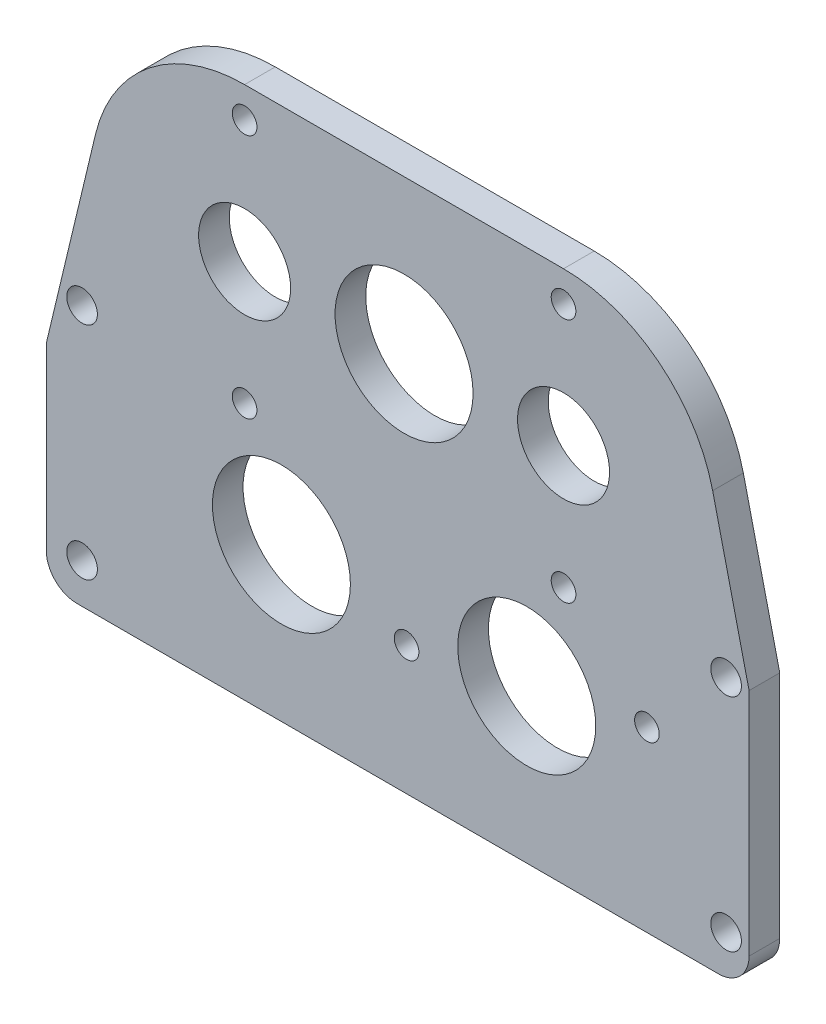
ISO-10303-21;
HEADER;
FILE_DESCRIPTION(('STEP AP214'),'2;1');
FILE_NAME('part.step','',(''),(''),'','','');
FILE_SCHEMA(('AUTOMOTIVE_DESIGN { 1 0 10303 214 1 1 1 1 }'));
ENDSEC;
DATA;
#1=APPLICATION_CONTEXT('core data for automotive mechanical design processes');
#2=APPLICATION_PROTOCOL_DEFINITION('international standard','automotive_design',2000,#1);
#3=PRODUCT_CONTEXT('',#1,'mechanical');
#4=PRODUCT('Part','Part','',(#3));
#5=PRODUCT_RELATED_PRODUCT_CATEGORY('part','',(#4));
#6=PRODUCT_DEFINITION_FORMATION('','',#4);
#7=PRODUCT_DEFINITION_CONTEXT('part definition',#1,'design');
#8=PRODUCT_DEFINITION('design','',#6,#7);
#9=PRODUCT_DEFINITION_SHAPE('','',#8);
#10=(LENGTH_UNIT() NAMED_UNIT(*) SI_UNIT(.MILLI.,.METRE.));
#11=(NAMED_UNIT(*) PLANE_ANGLE_UNIT() SI_UNIT($,.RADIAN.));
#12=(NAMED_UNIT(*) SI_UNIT($,.STERADIAN.) SOLID_ANGLE_UNIT());
#13=UNCERTAINTY_MEASURE_WITH_UNIT(LENGTH_MEASURE(1.E-05),#10,'distance_accuracy_value','');
#14=(GEOMETRIC_REPRESENTATION_CONTEXT(3) GLOBAL_UNCERTAINTY_ASSIGNED_CONTEXT((#13)) GLOBAL_UNIT_ASSIGNED_CONTEXT((#10,
#11,#12)) REPRESENTATION_CONTEXT('',''));
#15=CARTESIAN_POINT('',(0.,0.,0.));
#16=DIRECTION('',(0.,0.,1.));
#17=DIRECTION('',(1.,0.,0.));
#18=AXIS2_PLACEMENT_3D('',#15,#16,#17);
#19=CARTESIAN_POINT('',(58.42,46.9041106940532,6.35));
#20=DIRECTION('',(0.,0.,-1.));
#21=DIRECTION('',(-1.,0.,0.));
#22=AXIS2_PLACEMENT_3D('',#19,#20,#21);
#23=PLANE('',#22);
#24=DIRECTION('',(1.,0.,0.));
#25=VECTOR('',#24,1.);
#26=CARTESIAN_POINT('',(-48.6892529787857,-31.75,6.35));
#27=LINE('',#26,#25);
#28=CARTESIAN_POINT('',(-42.3392529787857,-31.75,6.35));
#29=VERTEX_POINT('',#28);
#30=CARTESIAN_POINT('',(90.4875,-31.75,6.35));
#31=VERTEX_POINT('',#30);
#32=EDGE_CURVE('E121',#29,#31,#27,.T.);
#33=ORIENTED_EDGE('',*,*,#32,.T.);
#34=CARTESIAN_POINT('',(90.4875,-25.4,6.35));
#35=DIRECTION('',(0.,0.,-1.));
#36=DIRECTION('',(-1.,0.,0.));
#37=AXIS2_PLACEMENT_3D('',#34,#35,#36);
#38=CIRCLE('',#37,6.35);
#39=CARTESIAN_POINT('',(96.8375,-25.4,6.35));
#40=VERTEX_POINT('',#39);
#41=EDGE_CURVE('E41',#31,#40,#38,.F.);
#42=ORIENTED_EDGE('',*,*,#41,.T.);
#43=DIRECTION('',(0.,1.,0.));
#44=VECTOR('',#43,1.);
#45=CARTESIAN_POINT('',(96.8375,22.225,6.35));
#46=LINE('',#45,#44);
#47=CARTESIAN_POINT('',(96.8375,22.225,6.35));
#48=VERTEX_POINT('',#47);
#49=EDGE_CURVE('E111',#40,#48,#46,.T.);
#50=ORIENTED_EDGE('',*,*,#49,.T.);
#51=DIRECTION('',(-0.228861878764831,0.973458905372092,0.));
#52=VECTOR('',#51,1.);
#53=CARTESIAN_POINT('',(96.8375,22.225,6.35));
#54=LINE('',#53,#52);
#55=CARTESIAN_POINT('',(89.2982328902418,54.2931047782294,6.35));
#56=VERTEX_POINT('',#55);
#57=EDGE_CURVE('E115',#48,#56,#54,.T.);
#58=ORIENTED_EDGE('',*,*,#57,.T.);
#59=CARTESIAN_POINT('',(58.42,46.9041106940532,6.35));
#60=DIRECTION('',(0.,0.,1.));
#61=DIRECTION('',(-1.,0.,0.));
#62=AXIS2_PLACEMENT_3D('',#59,#60,#61);
#63=CIRCLE('',#62,31.75);
#64=CARTESIAN_POINT('',(58.42,78.6541106940532,6.35));
#65=VERTEX_POINT('',#64);
#66=EDGE_CURVE('E136',#56,#65,#63,.T.);
#67=ORIENTED_EDGE('',*,*,#66,.T.);
#68=DIRECTION('',(-1.,0.,0.));
#69=VECTOR('',#68,1.);
#70=CARTESIAN_POINT('',(-7.62000000000001,78.6541106940532,6.35));
#71=LINE('',#70,#69);
#72=CARTESIAN_POINT('',(-7.62000000000001,78.6541106940532,6.35));
#73=VERTEX_POINT('',#72);
#74=EDGE_CURVE('E138',#65,#73,#71,.T.);
#75=ORIENTED_EDGE('',*,*,#74,.T.);
#76=CARTESIAN_POINT('',(-7.62000000000001,46.9041106940532,6.35));
#77=DIRECTION('',(0.,0.,1.));
#78=DIRECTION('',(-1.,0.,0.));
#79=AXIS2_PLACEMENT_3D('',#76,#77,#78);
#80=CIRCLE('',#79,31.75);
#81=CARTESIAN_POINT('',(-38.4982328902418,54.2931047782294,6.35));
#82=VERTEX_POINT('',#81);
#83=EDGE_CURVE('E143',#73,#82,#80,.T.);
#84=ORIENTED_EDGE('',*,*,#83,.T.);
#85=DIRECTION('',(-0.232724223123658,-0.972542768196592,0.));
#86=VECTOR('',#85,1.);
#87=CARTESIAN_POINT('',(-38.4982328902418,54.2931047782294,6.35));
#88=LINE('',#87,#86);
#89=CARTESIAN_POINT('',(-48.6892529787857,11.7053468103222,6.35));
#90=VERTEX_POINT('',#89);
#91=EDGE_CURVE('E145',#82,#90,#88,.T.);
#92=ORIENTED_EDGE('',*,*,#91,.T.);
#93=DIRECTION('',(0.,-1.,0.));
#94=VECTOR('',#93,1.);
#95=CARTESIAN_POINT('',(-48.6892529787857,11.7053468103222,6.35));
#96=LINE('',#95,#94);
#97=CARTESIAN_POINT('',(-48.6892529787857,-25.4,6.35));
#98=VERTEX_POINT('',#97);
#99=EDGE_CURVE('E164',#90,#98,#96,.T.);
#100=ORIENTED_EDGE('',*,*,#99,.T.);
#101=CARTESIAN_POINT('',(-42.3392529787857,-25.4,6.35));
#102=DIRECTION('',(0.,0.,-1.));
#103=DIRECTION('',(-1.,0.,0.));
#104=AXIS2_PLACEMENT_3D('',#101,#102,#103);
#105=CIRCLE('',#104,6.35);
#106=EDGE_CURVE('E186',#98,#29,#105,.F.);
#107=ORIENTED_EDGE('',*,*,#106,.T.);
#108=EDGE_LOOP('',(#33,#42,#50,#58,#67,#75,#84,#92,#100,#107));
#109=FACE_BOUND('',#108,.T.);
#110=CARTESIAN_POINT('',(0.,0.,6.35));
#111=DIRECTION('',(0.,0.,1.));
#112=DIRECTION('',(1.,0.,0.));
#113=AXIS2_PLACEMENT_3D('',#110,#111,#112);
#114=CIRCLE('',#113,14.2875);
#115=CARTESIAN_POINT('',(14.2875,0.,6.35));
#116=VERTEX_POINT('',#115);
#117=EDGE_CURVE('E151',#116,#116,#114,.T.);
#118=ORIENTED_EDGE('',*,*,#117,.F.);
#119=EDGE_LOOP('',(#118));
#120=FACE_BOUND('',#119,.T.);
#121=CARTESIAN_POINT('',(50.8,0.,6.35));
#122=DIRECTION('',(0.,0.,1.));
#123=DIRECTION('',(1.,0.,0.));
#124=AXIS2_PLACEMENT_3D('',#121,#122,#123);
#125=CIRCLE('',#124,14.2875);
#126=CARTESIAN_POINT('',(65.0875,0.,6.35));
#127=VERTEX_POINT('',#126);
#128=EDGE_CURVE('E545',#127,#127,#125,.T.);
#129=ORIENTED_EDGE('',*,*,#128,.F.);
#130=EDGE_LOOP('',(#129));
#131=FACE_BOUND('',#130,.T.);
#132=CARTESIAN_POINT('',(25.4,46.9041106940532,6.35));
#133=DIRECTION('',(0.,0.,1.));
#134=DIRECTION('',(1.,0.,0.));
#135=AXIS2_PLACEMENT_3D('',#132,#133,#134);
#136=CIRCLE('',#135,14.2875);
#137=CARTESIAN_POINT('',(39.6875,46.9041106940532,6.35));
#138=VERTEX_POINT('',#137);
#139=EDGE_CURVE('E539',#138,#138,#136,.T.);
#140=ORIENTED_EDGE('',*,*,#139,.F.);
#141=EDGE_LOOP('',(#140));
#142=FACE_BOUND('',#141,.T.);
#143=CARTESIAN_POINT('',(-7.62000000000001,72.3041106940532,6.35));
#144=DIRECTION('',(0.,0.,1.));
#145=DIRECTION('',(1.,0.,0.));
#146=AXIS2_PLACEMENT_3D('',#143,#144,#145);
#147=CIRCLE('',#146,2.5527);
#148=CARTESIAN_POINT('',(-5.06730000000002,72.3041106940532,6.35));
#149=VERTEX_POINT('',#148);
#150=EDGE_CURVE('E533',#149,#149,#147,.T.);
#151=ORIENTED_EDGE('',*,*,#150,.F.);
#152=EDGE_LOOP('',(#151));
#153=FACE_BOUND('',#152,.T.);
#154=CARTESIAN_POINT('',(-7.62000000000001,21.5041106940532,6.35));
#155=DIRECTION('',(0.,0.,1.));
#156=DIRECTION('',(1.,0.,0.));
#157=AXIS2_PLACEMENT_3D('',#154,#155,#156);
#158=CIRCLE('',#157,2.5527);
#159=CARTESIAN_POINT('',(-5.06730000000001,21.5041106940532,6.35));
#160=VERTEX_POINT('',#159);
#161=EDGE_CURVE('E527',#160,#160,#158,.T.);
#162=ORIENTED_EDGE('',*,*,#161,.F.);
#163=EDGE_LOOP('',(#162));
#164=FACE_BOUND('',#163,.T.);
#165=CARTESIAN_POINT('',(58.42,72.3041106940533,6.35));
#166=DIRECTION('',(0.,0.,1.));
#167=DIRECTION('',(1.,0.,0.));
#168=AXIS2_PLACEMENT_3D('',#165,#166,#167);
#169=CIRCLE('',#168,2.5527);
#170=CARTESIAN_POINT('',(60.9727,72.3041106940533,6.35));
#171=VERTEX_POINT('',#170);
#172=EDGE_CURVE('E521',#171,#171,#169,.T.);
#173=ORIENTED_EDGE('',*,*,#172,.F.);
#174=EDGE_LOOP('',(#173));
#175=FACE_BOUND('',#174,.T.);
#176=CARTESIAN_POINT('',(58.42,21.5041106940532,6.35));
#177=DIRECTION('',(0.,0.,1.));
#178=DIRECTION('',(1.,0.,0.));
#179=AXIS2_PLACEMENT_3D('',#176,#177,#178);
#180=CIRCLE('',#179,2.5527);
#181=CARTESIAN_POINT('',(60.9727,21.5041106940532,6.35));
#182=VERTEX_POINT('',#181);
#183=EDGE_CURVE('E515',#182,#182,#180,.T.);
#184=ORIENTED_EDGE('',*,*,#183,.F.);
#185=EDGE_LOOP('',(#184));
#186=FACE_BOUND('',#185,.T.);
#187=CARTESIAN_POINT('',(58.42,46.9041106940532,6.35));
#188=DIRECTION('',(0.,0.,1.));
#189=DIRECTION('',(1.,0.,0.));
#190=AXIS2_PLACEMENT_3D('',#187,#188,#189);
#191=CIRCLE('',#190,9.525);
#192=CARTESIAN_POINT('',(67.945,46.9041106940532,6.35));
#193=VERTEX_POINT('',#192);
#194=EDGE_CURVE('E509',#193,#193,#191,.T.);
#195=ORIENTED_EDGE('',*,*,#194,.F.);
#196=EDGE_LOOP('',(#195));
#197=FACE_BOUND('',#196,.T.);
#198=CARTESIAN_POINT('',(-7.62000000000001,46.9041106940532,6.35));
#199=DIRECTION('',(0.,0.,1.));
#200=DIRECTION('',(1.,0.,0.));
#201=AXIS2_PLACEMENT_3D('',#198,#199,#200);
#202=CIRCLE('',#201,9.525);
#203=CARTESIAN_POINT('',(1.90499999999999,46.9041106940532,6.35));
#204=VERTEX_POINT('',#203);
#205=EDGE_CURVE('E503',#204,#204,#202,.T.);
#206=ORIENTED_EDGE('',*,*,#205,.F.);
#207=EDGE_LOOP('',(#206));
#208=FACE_BOUND('',#207,.T.);
#209=CARTESIAN_POINT('',(25.9168201575522,-5.09778,6.35));
#210=DIRECTION('',(0.,0.,1.));
#211=DIRECTION('',(1.,0.,0.));
#212=AXIS2_PLACEMENT_3D('',#209,#210,#211);
#213=CIRCLE('',#212,2.5527);
#214=CARTESIAN_POINT('',(28.4695201575522,-5.09778,6.35));
#215=VERTEX_POINT('',#214);
#216=EDGE_CURVE('E497',#215,#215,#213,.T.);
#217=ORIENTED_EDGE('',*,*,#216,.F.);
#218=EDGE_LOOP('',(#217));
#219=FACE_BOUND('',#218,.T.);
#220=CARTESIAN_POINT('',(75.6831798424478,5.09777999999999,6.35));
#221=DIRECTION('',(0.,0.,1.));
#222=DIRECTION('',(1.,0.,0.));
#223=AXIS2_PLACEMENT_3D('',#220,#221,#222);
#224=CIRCLE('',#223,2.55270000000001);
#225=CARTESIAN_POINT('',(78.2358798424478,5.09777999999999,6.35));
#226=VERTEX_POINT('',#225);
#227=EDGE_CURVE('E491',#226,#226,#224,.T.);
#228=ORIENTED_EDGE('',*,*,#227,.F.);
#229=EDGE_LOOP('',(#228));
#230=FACE_BOUND('',#229,.T.);
#231=CARTESIAN_POINT('',(-41.275,22.225,6.35));
#232=DIRECTION('',(0.,0.,1.));
#233=DIRECTION('',(1.,0.,0.));
#234=AXIS2_PLACEMENT_3D('',#231,#232,#233);
#235=CIRCLE('',#234,3.17500000000098);
#236=CARTESIAN_POINT('',(-38.099999999999,22.225,6.35));
#237=VERTEX_POINT('',#236);
#238=EDGE_CURVE('E485',#237,#237,#235,.T.);
#239=ORIENTED_EDGE('',*,*,#238,.F.);
#240=EDGE_LOOP('',(#239));
#241=FACE_BOUND('',#240,.T.);
#242=CARTESIAN_POINT('',(92.075,22.225,6.35));
#243=DIRECTION('',(0.,0.,1.));
#244=DIRECTION('',(1.,0.,0.));
#245=AXIS2_PLACEMENT_3D('',#242,#243,#244);
#246=CIRCLE('',#245,3.17500000000098);
#247=CARTESIAN_POINT('',(95.250000000001,22.225,6.35));
#248=VERTEX_POINT('',#247);
#249=EDGE_CURVE('E479',#248,#248,#246,.T.);
#250=ORIENTED_EDGE('',*,*,#249,.F.);
#251=EDGE_LOOP('',(#250));
#252=FACE_BOUND('',#251,.T.);
#253=CARTESIAN_POINT('',(-41.275,-23.495,6.35));
#254=DIRECTION('',(0.,0.,1.));
#255=DIRECTION('',(1.,0.,0.));
#256=AXIS2_PLACEMENT_3D('',#253,#254,#255);
#257=CIRCLE('',#256,3.17500000000098);
#258=CARTESIAN_POINT('',(-38.099999999999,-23.495,6.35));
#259=VERTEX_POINT('',#258);
#260=EDGE_CURVE('E466',#259,#259,#257,.T.);
#261=ORIENTED_EDGE('',*,*,#260,.F.);
#262=EDGE_LOOP('',(#261));
#263=FACE_BOUND('',#262,.T.);
#264=CARTESIAN_POINT('',(92.075,-23.495,6.35));
#265=DIRECTION('',(0.,0.,1.));
#266=DIRECTION('',(1.,0.,0.));
#267=AXIS2_PLACEMENT_3D('',#264,#265,#266);
#268=CIRCLE('',#267,3.17500000000098);
#269=CARTESIAN_POINT('',(95.250000000001,-23.495,6.35));
#270=VERTEX_POINT('',#269);
#271=EDGE_CURVE('E470',#270,#270,#268,.T.);
#272=ORIENTED_EDGE('',*,*,#271,.F.);
#273=EDGE_LOOP('',(#272));
#274=FACE_BOUND('',#273,.T.);
#275=ADVANCED_FACE('F33',(#109,#120,#131,#142,#153,#164,#175,#186,#197,#208,#219,#230,#241,#252,
#263,#274),#23,.F.);
#276=CARTESIAN_POINT('',(58.42,46.9041106940532,0.));
#277=DIRECTION('',(0.,0.,-1.));
#278=DIRECTION('',(-1.,0.,0.));
#279=AXIS2_PLACEMENT_3D('',#276,#277,#278);
#280=PLANE('',#279);
#281=CARTESIAN_POINT('',(-41.275,-23.495,0.));
#282=DIRECTION('',(0.,0.,1.));
#283=DIRECTION('',(1.,0.,0.));
#284=AXIS2_PLACEMENT_3D('',#281,#282,#283);
#285=CIRCLE('',#284,3.17500000000098);
#286=CARTESIAN_POINT('',(-38.099999999999,-23.495,0.));
#287=VERTEX_POINT('',#286);
#288=EDGE_CURVE('E469',#287,#287,#285,.T.);
#289=ORIENTED_EDGE('',*,*,#288,.T.);
#290=EDGE_LOOP('',(#289));
#291=FACE_BOUND('',#290,.T.);
#292=CARTESIAN_POINT('',(-41.275,22.225,0.));
#293=DIRECTION('',(0.,0.,1.));
#294=DIRECTION('',(1.,0.,0.));
#295=AXIS2_PLACEMENT_3D('',#292,#293,#294);
#296=CIRCLE('',#295,3.17500000000098);
#297=CARTESIAN_POINT('',(-38.099999999999,22.225,0.));
#298=VERTEX_POINT('',#297);
#299=EDGE_CURVE('E482',#298,#298,#296,.T.);
#300=ORIENTED_EDGE('',*,*,#299,.T.);
#301=EDGE_LOOP('',(#300));
#302=FACE_BOUND('',#301,.T.);
#303=CARTESIAN_POINT('',(25.9168201575522,-5.09778,0.));
#304=DIRECTION('',(0.,0.,1.));
#305=DIRECTION('',(1.,0.,0.));
#306=AXIS2_PLACEMENT_3D('',#303,#304,#305);
#307=CIRCLE('',#306,2.5527);
#308=CARTESIAN_POINT('',(28.4695201575522,-5.09778,0.));
#309=VERTEX_POINT('',#308);
#310=EDGE_CURVE('E494',#309,#309,#307,.T.);
#311=ORIENTED_EDGE('',*,*,#310,.T.);
#312=EDGE_LOOP('',(#311));
#313=FACE_BOUND('',#312,.T.);
#314=CARTESIAN_POINT('',(58.42,46.9041106940532,0.));
#315=DIRECTION('',(0.,0.,1.));
#316=DIRECTION('',(1.,0.,0.));
#317=AXIS2_PLACEMENT_3D('',#314,#315,#316);
#318=CIRCLE('',#317,9.525);
#319=CARTESIAN_POINT('',(67.945,46.9041106940532,0.));
#320=VERTEX_POINT('',#319);
#321=EDGE_CURVE('E506',#320,#320,#318,.T.);
#322=ORIENTED_EDGE('',*,*,#321,.T.);
#323=EDGE_LOOP('',(#322));
#324=FACE_BOUND('',#323,.T.);
#325=CARTESIAN_POINT('',(58.42,72.3041106940533,0.));
#326=DIRECTION('',(0.,0.,1.));
#327=DIRECTION('',(1.,0.,0.));
#328=AXIS2_PLACEMENT_3D('',#325,#326,#327);
#329=CIRCLE('',#328,2.5527);
#330=CARTESIAN_POINT('',(60.9727,72.3041106940533,0.));
#331=VERTEX_POINT('',#330);
#332=EDGE_CURVE('E518',#331,#331,#329,.T.);
#333=ORIENTED_EDGE('',*,*,#332,.T.);
#334=EDGE_LOOP('',(#333));
#335=FACE_BOUND('',#334,.T.);
#336=CARTESIAN_POINT('',(-7.62000000000001,72.3041106940532,0.));
#337=DIRECTION('',(0.,0.,1.));
#338=DIRECTION('',(1.,0.,0.));
#339=AXIS2_PLACEMENT_3D('',#336,#337,#338);
#340=CIRCLE('',#339,2.5527);
#341=CARTESIAN_POINT('',(-5.06730000000002,72.3041106940532,0.));
#342=VERTEX_POINT('',#341);
#343=EDGE_CURVE('E530',#342,#342,#340,.T.);
#344=ORIENTED_EDGE('',*,*,#343,.T.);
#345=EDGE_LOOP('',(#344));
#346=FACE_BOUND('',#345,.T.);
#347=CARTESIAN_POINT('',(50.8,0.,0.));
#348=DIRECTION('',(0.,0.,1.));
#349=DIRECTION('',(1.,0.,0.));
#350=AXIS2_PLACEMENT_3D('',#347,#348,#349);
#351=CIRCLE('',#350,14.2875);
#352=CARTESIAN_POINT('',(65.0875,0.,0.));
#353=VERTEX_POINT('',#352);
#354=EDGE_CURVE('E542',#353,#353,#351,.T.);
#355=ORIENTED_EDGE('',*,*,#354,.T.);
#356=EDGE_LOOP('',(#355));
#357=FACE_BOUND('',#356,.T.);
#358=DIRECTION('',(0.,1.,0.));
#359=VECTOR('',#358,1.);
#360=CARTESIAN_POINT('',(96.8375,22.225,0.));
#361=LINE('',#360,#359);
#362=CARTESIAN_POINT('',(96.8375,-25.4,0.));
#363=VERTEX_POINT('',#362);
#364=CARTESIAN_POINT('',(96.8375,22.225,0.));
#365=VERTEX_POINT('',#364);
#366=EDGE_CURVE('E127',#363,#365,#361,.T.);
#367=ORIENTED_EDGE('',*,*,#366,.F.);
#368=CARTESIAN_POINT('',(90.4875,-25.4,0.));
#369=DIRECTION('',(0.,0.,-1.));
#370=DIRECTION('',(-1.,0.,0.));
#371=AXIS2_PLACEMENT_3D('',#368,#369,#370);
#372=CIRCLE('',#371,6.35);
#373=CARTESIAN_POINT('',(90.4875,-31.75,0.));
#374=VERTEX_POINT('',#373);
#375=EDGE_CURVE('E180',#363,#374,#372,.T.);
#376=ORIENTED_EDGE('',*,*,#375,.T.);
#377=DIRECTION('',(1.,0.,0.));
#378=VECTOR('',#377,1.);
#379=CARTESIAN_POINT('',(-48.6892529787857,-31.75,0.));
#380=LINE('',#379,#378);
#381=CARTESIAN_POINT('',(-42.3392529787857,-31.75,0.));
#382=VERTEX_POINT('',#381);
#383=EDGE_CURVE('E150',#382,#374,#380,.T.);
#384=ORIENTED_EDGE('',*,*,#383,.F.);
#385=CARTESIAN_POINT('',(-42.3392529787857,-25.4,0.));
#386=DIRECTION('',(0.,0.,-1.));
#387=DIRECTION('',(-1.,0.,0.));
#388=AXIS2_PLACEMENT_3D('',#385,#386,#387);
#389=CIRCLE('',#388,6.35);
#390=CARTESIAN_POINT('',(-48.6892529787857,-25.4,0.));
#391=VERTEX_POINT('',#390);
#392=EDGE_CURVE('E178',#382,#391,#389,.T.);
#393=ORIENTED_EDGE('',*,*,#392,.T.);
#394=DIRECTION('',(0.,-1.,0.));
#395=VECTOR('',#394,1.);
#396=CARTESIAN_POINT('',(-48.6892529787857,11.7053468103222,0.));
#397=LINE('',#396,#395);
#398=CARTESIAN_POINT('',(-48.6892529787857,11.7053468103222,0.));
#399=VERTEX_POINT('',#398);
#400=EDGE_CURVE('E148',#399,#391,#397,.T.);
#401=ORIENTED_EDGE('',*,*,#400,.F.);
#402=DIRECTION('',(-0.232724223123658,-0.972542768196592,0.));
#403=VECTOR('',#402,1.);
#404=CARTESIAN_POINT('',(-38.4982328902418,54.2931047782294,0.));
#405=LINE('',#404,#403);
#406=CARTESIAN_POINT('',(-38.4982328902418,54.2931047782294,0.));
#407=VERTEX_POINT('',#406);
#408=EDGE_CURVE('E162',#407,#399,#405,.T.);
#409=ORIENTED_EDGE('',*,*,#408,.F.);
#410=CARTESIAN_POINT('',(-7.62000000000001,46.9041106940532,0.));
#411=DIRECTION('',(0.,0.,1.));
#412=DIRECTION('',(-1.,0.,0.));
#413=AXIS2_PLACEMENT_3D('',#410,#411,#412);
#414=CIRCLE('',#413,31.75);
#415=CARTESIAN_POINT('',(-7.62000000000001,78.6541106940532,0.));
#416=VERTEX_POINT('',#415);
#417=EDGE_CURVE('E160',#416,#407,#414,.T.);
#418=ORIENTED_EDGE('',*,*,#417,.F.);
#419=DIRECTION('',(-1.,0.,0.));
#420=VECTOR('',#419,1.);
#421=CARTESIAN_POINT('',(-7.62000000000001,78.6541106940532,0.));
#422=LINE('',#421,#420);
#423=CARTESIAN_POINT('',(58.42,78.6541106940532,0.));
#424=VERTEX_POINT('',#423);
#425=EDGE_CURVE('E158',#424,#416,#422,.T.);
#426=ORIENTED_EDGE('',*,*,#425,.F.);
#427=CARTESIAN_POINT('',(58.42,46.9041106940532,0.));
#428=DIRECTION('',(0.,0.,1.));
#429=DIRECTION('',(-1.,0.,0.));
#430=AXIS2_PLACEMENT_3D('',#427,#428,#429);
#431=CIRCLE('',#430,31.75);
#432=CARTESIAN_POINT('',(89.2982328902418,54.2931047782294,0.));
#433=VERTEX_POINT('',#432);
#434=EDGE_CURVE('E156',#433,#424,#431,.T.);
#435=ORIENTED_EDGE('',*,*,#434,.F.);
#436=DIRECTION('',(-0.228861878764831,0.973458905372092,0.));
#437=VECTOR('',#436,1.);
#438=CARTESIAN_POINT('',(96.8375,22.225,0.));
#439=LINE('',#438,#437);
#440=EDGE_CURVE('E154',#365,#433,#439,.T.);
#441=ORIENTED_EDGE('',*,*,#440,.F.);
#442=EDGE_LOOP('',(#367,#376,#384,#393,#401,#409,#418,#426,#435,#441));
#443=FACE_BOUND('',#442,.T.);
#444=CARTESIAN_POINT('',(0.,0.,0.));
#445=DIRECTION('',(0.,0.,1.));
#446=DIRECTION('',(1.,0.,0.));
#447=AXIS2_PLACEMENT_3D('',#444,#445,#446);
#448=CIRCLE('',#447,14.2875);
#449=CARTESIAN_POINT('',(14.2875,0.,0.));
#450=VERTEX_POINT('',#449);
#451=EDGE_CURVE('E548',#450,#450,#448,.T.);
#452=ORIENTED_EDGE('',*,*,#451,.T.);
#453=EDGE_LOOP('',(#452));
#454=FACE_BOUND('',#453,.T.);
#455=CARTESIAN_POINT('',(25.4,46.9041106940532,0.));
#456=DIRECTION('',(0.,0.,1.));
#457=DIRECTION('',(1.,0.,0.));
#458=AXIS2_PLACEMENT_3D('',#455,#456,#457);
#459=CIRCLE('',#458,14.2875);
#460=CARTESIAN_POINT('',(39.6875,46.9041106940532,0.));
#461=VERTEX_POINT('',#460);
#462=EDGE_CURVE('E536',#461,#461,#459,.T.);
#463=ORIENTED_EDGE('',*,*,#462,.T.);
#464=EDGE_LOOP('',(#463));
#465=FACE_BOUND('',#464,.T.);
#466=CARTESIAN_POINT('',(-7.62000000000001,21.5041106940532,0.));
#467=DIRECTION('',(0.,0.,1.));
#468=DIRECTION('',(1.,0.,0.));
#469=AXIS2_PLACEMENT_3D('',#466,#467,#468);
#470=CIRCLE('',#469,2.5527);
#471=CARTESIAN_POINT('',(-5.06730000000001,21.5041106940532,0.));
#472=VERTEX_POINT('',#471);
#473=EDGE_CURVE('E524',#472,#472,#470,.T.);
#474=ORIENTED_EDGE('',*,*,#473,.T.);
#475=EDGE_LOOP('',(#474));
#476=FACE_BOUND('',#475,.T.);
#477=CARTESIAN_POINT('',(58.42,21.5041106940532,0.));
#478=DIRECTION('',(0.,0.,1.));
#479=DIRECTION('',(1.,0.,0.));
#480=AXIS2_PLACEMENT_3D('',#477,#478,#479);
#481=CIRCLE('',#480,2.5527);
#482=CARTESIAN_POINT('',(60.9727,21.5041106940532,0.));
#483=VERTEX_POINT('',#482);
#484=EDGE_CURVE('E512',#483,#483,#481,.T.);
#485=ORIENTED_EDGE('',*,*,#484,.T.);
#486=EDGE_LOOP('',(#485));
#487=FACE_BOUND('',#486,.T.);
#488=CARTESIAN_POINT('',(-7.62000000000001,46.9041106940532,0.));
#489=DIRECTION('',(0.,0.,1.));
#490=DIRECTION('',(1.,0.,0.));
#491=AXIS2_PLACEMENT_3D('',#488,#489,#490);
#492=CIRCLE('',#491,9.525);
#493=CARTESIAN_POINT('',(1.90499999999999,46.9041106940532,0.));
#494=VERTEX_POINT('',#493);
#495=EDGE_CURVE('E500',#494,#494,#492,.T.);
#496=ORIENTED_EDGE('',*,*,#495,.T.);
#497=EDGE_LOOP('',(#496));
#498=FACE_BOUND('',#497,.T.);
#499=CARTESIAN_POINT('',(75.6831798424478,5.09777999999999,0.));
#500=DIRECTION('',(0.,0.,1.));
#501=DIRECTION('',(1.,0.,0.));
#502=AXIS2_PLACEMENT_3D('',#499,#500,#501);
#503=CIRCLE('',#502,2.55270000000001);
#504=CARTESIAN_POINT('',(78.2358798424478,5.09777999999999,0.));
#505=VERTEX_POINT('',#504);
#506=EDGE_CURVE('E488',#505,#505,#503,.T.);
#507=ORIENTED_EDGE('',*,*,#506,.T.);
#508=EDGE_LOOP('',(#507));
#509=FACE_BOUND('',#508,.T.);
#510=CARTESIAN_POINT('',(92.075,22.225,0.));
#511=DIRECTION('',(0.,0.,1.));
#512=DIRECTION('',(1.,0.,0.));
#513=AXIS2_PLACEMENT_3D('',#510,#511,#512);
#514=CIRCLE('',#513,3.17500000000098);
#515=CARTESIAN_POINT('',(95.250000000001,22.225,0.));
#516=VERTEX_POINT('',#515);
#517=EDGE_CURVE('E472',#516,#516,#514,.T.);
#518=ORIENTED_EDGE('',*,*,#517,.T.);
#519=EDGE_LOOP('',(#518));
#520=FACE_BOUND('',#519,.T.);
#521=CARTESIAN_POINT('',(92.075,-23.495,0.));
#522=DIRECTION('',(0.,0.,1.));
#523=DIRECTION('',(1.,0.,0.));
#524=AXIS2_PLACEMENT_3D('',#521,#522,#523);
#525=CIRCLE('',#524,3.17500000000098);
#526=CARTESIAN_POINT('',(95.250000000001,-23.495,0.));
#527=VERTEX_POINT('',#526);
#528=EDGE_CURVE('E475',#527,#527,#525,.T.);
#529=ORIENTED_EDGE('',*,*,#528,.T.);
#530=EDGE_LOOP('',(#529));
#531=FACE_BOUND('',#530,.T.);
#532=ADVANCED_FACE('F194',(#291,#302,#313,#324,#335,#346,#357,#443,#454,#465,#476,#487,#498,
#509,#520,#531),#280,.T.);
#533=CARTESIAN_POINT('',(-48.6892529787857,11.7053468103222,6.35));
#534=DIRECTION('',(1.,0.,0.));
#535=DIRECTION('',(0.,1.,0.));
#536=AXIS2_PLACEMENT_3D('',#533,#534,#535);
#537=PLANE('',#536);
#538=ORIENTED_EDGE('',*,*,#400,.T.);
#539=DIRECTION('',(0.,0.,-1.));
#540=VECTOR('',#539,1.);
#541=CARTESIAN_POINT('',(-48.6892529787857,-25.4,6.35));
#542=LINE('',#541,#540);
#543=EDGE_CURVE('E11',#391,#98,#542,.F.);
#544=ORIENTED_EDGE('',*,*,#543,.T.);
#545=ORIENTED_EDGE('',*,*,#99,.F.);
#546=DIRECTION('',(0.,0.,-1.));
#547=VECTOR('',#546,1.);
#548=CARTESIAN_POINT('',(-48.6892529787857,11.7053468103222,6.35));
#549=LINE('',#548,#547);
#550=EDGE_CURVE('E147',#90,#399,#549,.T.);
#551=ORIENTED_EDGE('',*,*,#550,.T.);
#552=EDGE_LOOP('',(#538,#544,#545,#551));
#553=FACE_BOUND('',#552,.T.);
#554=ADVANCED_FACE('F197',(#553),#537,.F.);
#555=CARTESIAN_POINT('',(-48.6892529787857,-31.75,6.35));
#556=DIRECTION('',(0.,1.,0.));
#557=DIRECTION('',(0.,0.,1.));
#558=AXIS2_PLACEMENT_3D('',#555,#556,#557);
#559=PLANE('',#558);
#560=ORIENTED_EDGE('',*,*,#383,.T.);
#561=DIRECTION('',(0.,0.,-1.));
#562=VECTOR('',#561,1.);
#563=CARTESIAN_POINT('',(90.4875,-31.75,6.35));
#564=LINE('',#563,#562);
#565=EDGE_CURVE('E54',#374,#31,#564,.F.);
#566=ORIENTED_EDGE('',*,*,#565,.T.);
#567=ORIENTED_EDGE('',*,*,#32,.F.);
#568=DIRECTION('',(0.,0.,-1.));
#569=VECTOR('',#568,1.);
#570=CARTESIAN_POINT('',(-42.3392529787857,-31.75,6.35));
#571=LINE('',#570,#569);
#572=EDGE_CURVE('E182',#29,#382,#571,.T.);
#573=ORIENTED_EDGE('',*,*,#572,.T.);
#574=EDGE_LOOP('',(#560,#566,#567,#573));
#575=FACE_BOUND('',#574,.T.);
#576=ADVANCED_FACE('F190',(#575),#559,.F.);
#577=CARTESIAN_POINT('',(96.8375,22.225,6.35));
#578=DIRECTION('',(-1.,0.,0.));
#579=DIRECTION('',(0.,0.,1.));
#580=AXIS2_PLACEMENT_3D('',#577,#578,#579);
#581=PLANE('',#580);
#582=ORIENTED_EDGE('',*,*,#49,.F.);
#583=DIRECTION('',(0.,0.,-1.));
#584=VECTOR('',#583,1.);
#585=CARTESIAN_POINT('',(96.8375,-25.4,6.35));
#586=LINE('',#585,#584);
#587=EDGE_CURVE('E130',#40,#363,#586,.T.);
#588=ORIENTED_EDGE('',*,*,#587,.T.);
#589=ORIENTED_EDGE('',*,*,#366,.T.);
#590=DIRECTION('',(0.,0.,-1.));
#591=VECTOR('',#590,1.);
#592=CARTESIAN_POINT('',(96.8375,22.225,6.35));
#593=LINE('',#592,#591);
#594=EDGE_CURVE('E124',#48,#365,#593,.T.);
#595=ORIENTED_EDGE('',*,*,#594,.F.);
#596=EDGE_LOOP('',(#582,#588,#589,#595));
#597=FACE_BOUND('',#596,.T.);
#598=ADVANCED_FACE('F125',(#597),#581,.F.);
#599=CARTESIAN_POINT('',(96.8375,22.225,6.35));
#600=DIRECTION('',(-0.973458905372092,-0.228861878764831,0.));
#601=DIRECTION('',(0.228861878764831,-0.973458905372092,0.));
#602=AXIS2_PLACEMENT_3D('',#599,#600,#601);
#603=PLANE('',#602);
#604=ORIENTED_EDGE('',*,*,#440,.T.);
#605=DIRECTION('',(0.,0.,-1.));
#606=VECTOR('',#605,1.);
#607=CARTESIAN_POINT('',(89.2982328902418,54.2931047782294,6.35));
#608=LINE('',#607,#606);
#609=EDGE_CURVE('E131',#56,#433,#608,.T.);
#610=ORIENTED_EDGE('',*,*,#609,.F.);
#611=ORIENTED_EDGE('',*,*,#57,.F.);
#612=ORIENTED_EDGE('',*,*,#594,.T.);
#613=EDGE_LOOP('',(#604,#610,#611,#612));
#614=FACE_BOUND('',#613,.T.);
#615=ADVANCED_FACE('F133',(#614),#603,.F.);
#616=CARTESIAN_POINT('',(58.42,46.9041106940532,6.35));
#617=DIRECTION('',(0.,0.,-1.));
#618=DIRECTION('',(-1.,0.,0.));
#619=AXIS2_PLACEMENT_3D('',#616,#617,#618);
#620=CYLINDRICAL_SURFACE('',#619,31.75);
#621=ORIENTED_EDGE('',*,*,#434,.T.);
#622=DIRECTION('',(0.,0.,-1.));
#623=VECTOR('',#622,1.);
#624=CARTESIAN_POINT('',(58.42,78.6541106940532,6.35));
#625=LINE('',#624,#623);
#626=EDGE_CURVE('E173',#65,#424,#625,.T.);
#627=ORIENTED_EDGE('',*,*,#626,.F.);
#628=ORIENTED_EDGE('',*,*,#66,.F.);
#629=ORIENTED_EDGE('',*,*,#609,.T.);
#630=EDGE_LOOP('',(#621,#627,#628,#629));
#631=FACE_BOUND('',#630,.T.);
#632=ADVANCED_FACE('F215',(#631),#620,.T.);
#633=CARTESIAN_POINT('',(-7.62000000000001,78.6541106940532,6.35));
#634=DIRECTION('',(0.,-1.,0.));
#635=DIRECTION('',(1.,0.,0.));
#636=AXIS2_PLACEMENT_3D('',#633,#634,#635);
#637=PLANE('',#636);
#638=ORIENTED_EDGE('',*,*,#425,.T.);
#639=DIRECTION('',(0.,0.,-1.));
#640=VECTOR('',#639,1.);
#641=CARTESIAN_POINT('',(-7.62000000000001,78.6541106940532,6.35));
#642=LINE('',#641,#640);
#643=EDGE_CURVE('E170',#73,#416,#642,.T.);
#644=ORIENTED_EDGE('',*,*,#643,.F.);
#645=ORIENTED_EDGE('',*,*,#74,.F.);
#646=ORIENTED_EDGE('',*,*,#626,.T.);
#647=EDGE_LOOP('',(#638,#644,#645,#646));
#648=FACE_BOUND('',#647,.T.);
#649=ADVANCED_FACE('F212',(#648),#637,.F.);
#650=CARTESIAN_POINT('',(-7.62000000000001,46.9041106940532,6.35));
#651=DIRECTION('',(0.,0.,-1.));
#652=DIRECTION('',(-1.,0.,0.));
#653=AXIS2_PLACEMENT_3D('',#650,#651,#652);
#654=CYLINDRICAL_SURFACE('',#653,31.75);
#655=ORIENTED_EDGE('',*,*,#417,.T.);
#656=DIRECTION('',(0.,0.,-1.));
#657=VECTOR('',#656,1.);
#658=CARTESIAN_POINT('',(-38.4982328902418,54.2931047782294,6.35));
#659=LINE('',#658,#657);
#660=EDGE_CURVE('E167',#82,#407,#659,.T.);
#661=ORIENTED_EDGE('',*,*,#660,.F.);
#662=ORIENTED_EDGE('',*,*,#83,.F.);
#663=ORIENTED_EDGE('',*,*,#643,.T.);
#664=EDGE_LOOP('',(#655,#661,#662,#663));
#665=FACE_BOUND('',#664,.T.);
#666=ADVANCED_FACE('F207',(#665),#654,.T.);
#667=CARTESIAN_POINT('',(-38.4982328902418,54.2931047782294,6.35));
#668=DIRECTION('',(0.972542768196592,-0.232724223123658,0.));
#669=DIRECTION('',(0.232724223123658,0.972542768196592,0.));
#670=AXIS2_PLACEMENT_3D('',#667,#668,#669);
#671=PLANE('',#670);
#672=ORIENTED_EDGE('',*,*,#408,.T.);
#673=ORIENTED_EDGE('',*,*,#550,.F.);
#674=ORIENTED_EDGE('',*,*,#91,.F.);
#675=ORIENTED_EDGE('',*,*,#660,.T.);
#676=EDGE_LOOP('',(#672,#673,#674,#675));
#677=FACE_BOUND('',#676,.T.);
#678=ADVANCED_FACE('F201',(#677),#671,.F.);
#679=CARTESIAN_POINT('',(0.,0.,6.35));
#680=DIRECTION('',(0.,0.,-1.));
#681=DIRECTION('',(-1.,0.,0.));
#682=AXIS2_PLACEMENT_3D('',#679,#680,#681);
#683=CYLINDRICAL_SURFACE('',#682,14.2875);
#684=ORIENTED_EDGE('',*,*,#117,.T.);
#685=EDGE_LOOP('',(#684));
#686=FACE_BOUND('',#685,.T.);
#687=ORIENTED_EDGE('',*,*,#451,.F.);
#688=EDGE_LOOP('',(#687));
#689=FACE_BOUND('',#688,.T.);
#690=ADVANCED_FACE('F236',(#686,#689),#683,.F.);
#691=CARTESIAN_POINT('',(50.8,0.,6.35));
#692=DIRECTION('',(0.,0.,-1.));
#693=DIRECTION('',(-1.,0.,0.));
#694=AXIS2_PLACEMENT_3D('',#691,#692,#693);
#695=CYLINDRICAL_SURFACE('',#694,14.2875);
#696=ORIENTED_EDGE('',*,*,#128,.T.);
#697=EDGE_LOOP('',(#696));
#698=FACE_BOUND('',#697,.T.);
#699=ORIENTED_EDGE('',*,*,#354,.F.);
#700=EDGE_LOOP('',(#699));
#701=FACE_BOUND('',#700,.T.);
#702=ADVANCED_FACE('F291',(#698,#701),#695,.F.);
#703=CARTESIAN_POINT('',(25.4,46.9041106940532,6.35));
#704=DIRECTION('',(0.,0.,-1.));
#705=DIRECTION('',(-1.,0.,0.));
#706=AXIS2_PLACEMENT_3D('',#703,#704,#705);
#707=CYLINDRICAL_SURFACE('',#706,14.2875);
#708=ORIENTED_EDGE('',*,*,#139,.T.);
#709=EDGE_LOOP('',(#708));
#710=FACE_BOUND('',#709,.T.);
#711=ORIENTED_EDGE('',*,*,#462,.F.);
#712=EDGE_LOOP('',(#711));
#713=FACE_BOUND('',#712,.T.);
#714=ADVANCED_FACE('F298',(#710,#713),#707,.F.);
#715=CARTESIAN_POINT('',(-7.62000000000001,72.3041106940532,6.35));
#716=DIRECTION('',(0.,0.,-1.));
#717=DIRECTION('',(-1.,0.,0.));
#718=AXIS2_PLACEMENT_3D('',#715,#716,#717);
#719=CYLINDRICAL_SURFACE('',#718,2.5527);
#720=ORIENTED_EDGE('',*,*,#150,.T.);
#721=EDGE_LOOP('',(#720));
#722=FACE_BOUND('',#721,.T.);
#723=ORIENTED_EDGE('',*,*,#343,.F.);
#724=EDGE_LOOP('',(#723));
#725=FACE_BOUND('',#724,.T.);
#726=ADVANCED_FACE('F305',(#722,#725),#719,.F.);
#727=CARTESIAN_POINT('',(-7.62000000000001,21.5041106940532,6.35));
#728=DIRECTION('',(0.,0.,-1.));
#729=DIRECTION('',(-1.,0.,0.));
#730=AXIS2_PLACEMENT_3D('',#727,#728,#729);
#731=CYLINDRICAL_SURFACE('',#730,2.5527);
#732=ORIENTED_EDGE('',*,*,#161,.T.);
#733=EDGE_LOOP('',(#732));
#734=FACE_BOUND('',#733,.T.);
#735=ORIENTED_EDGE('',*,*,#473,.F.);
#736=EDGE_LOOP('',(#735));
#737=FACE_BOUND('',#736,.T.);
#738=ADVANCED_FACE('F313',(#734,#737),#731,.F.);
#739=CARTESIAN_POINT('',(58.42,72.3041106940533,6.35));
#740=DIRECTION('',(0.,0.,-1.));
#741=DIRECTION('',(-1.,0.,0.));
#742=AXIS2_PLACEMENT_3D('',#739,#740,#741);
#743=CYLINDRICAL_SURFACE('',#742,2.5527);
#744=ORIENTED_EDGE('',*,*,#172,.T.);
#745=EDGE_LOOP('',(#744));
#746=FACE_BOUND('',#745,.T.);
#747=ORIENTED_EDGE('',*,*,#332,.F.);
#748=EDGE_LOOP('',(#747));
#749=FACE_BOUND('',#748,.T.);
#750=ADVANCED_FACE('F321',(#746,#749),#743,.F.);
#751=CARTESIAN_POINT('',(58.42,21.5041106940532,6.35));
#752=DIRECTION('',(0.,0.,-1.));
#753=DIRECTION('',(-1.,0.,0.));
#754=AXIS2_PLACEMENT_3D('',#751,#752,#753);
#755=CYLINDRICAL_SURFACE('',#754,2.5527);
#756=ORIENTED_EDGE('',*,*,#183,.T.);
#757=EDGE_LOOP('',(#756));
#758=FACE_BOUND('',#757,.T.);
#759=ORIENTED_EDGE('',*,*,#484,.F.);
#760=EDGE_LOOP('',(#759));
#761=FACE_BOUND('',#760,.T.);
#762=ADVANCED_FACE('F329',(#758,#761),#755,.F.);
#763=CARTESIAN_POINT('',(58.42,46.9041106940532,6.35));
#764=DIRECTION('',(0.,0.,-1.));
#765=DIRECTION('',(-1.,0.,0.));
#766=AXIS2_PLACEMENT_3D('',#763,#764,#765);
#767=CYLINDRICAL_SURFACE('',#766,9.525);
#768=ORIENTED_EDGE('',*,*,#194,.T.);
#769=EDGE_LOOP('',(#768));
#770=FACE_BOUND('',#769,.T.);
#771=ORIENTED_EDGE('',*,*,#321,.F.);
#772=EDGE_LOOP('',(#771));
#773=FACE_BOUND('',#772,.T.);
#774=ADVANCED_FACE('F337',(#770,#773),#767,.F.);
#775=CARTESIAN_POINT('',(-7.62000000000001,46.9041106940532,6.35));
#776=DIRECTION('',(0.,0.,-1.));
#777=DIRECTION('',(-1.,0.,0.));
#778=AXIS2_PLACEMENT_3D('',#775,#776,#777);
#779=CYLINDRICAL_SURFACE('',#778,9.525);
#780=ORIENTED_EDGE('',*,*,#205,.T.);
#781=EDGE_LOOP('',(#780));
#782=FACE_BOUND('',#781,.T.);
#783=ORIENTED_EDGE('',*,*,#495,.F.);
#784=EDGE_LOOP('',(#783));
#785=FACE_BOUND('',#784,.T.);
#786=ADVANCED_FACE('F345',(#782,#785),#779,.F.);
#787=CARTESIAN_POINT('',(25.9168201575522,-5.09778,6.35));
#788=DIRECTION('',(0.,0.,-1.));
#789=DIRECTION('',(-1.,0.,0.));
#790=AXIS2_PLACEMENT_3D('',#787,#788,#789);
#791=CYLINDRICAL_SURFACE('',#790,2.5527);
#792=ORIENTED_EDGE('',*,*,#216,.T.);
#793=EDGE_LOOP('',(#792));
#794=FACE_BOUND('',#793,.T.);
#795=ORIENTED_EDGE('',*,*,#310,.F.);
#796=EDGE_LOOP('',(#795));
#797=FACE_BOUND('',#796,.T.);
#798=ADVANCED_FACE('F353',(#794,#797),#791,.F.);
#799=CARTESIAN_POINT('',(75.6831798424478,5.09777999999999,6.35));
#800=DIRECTION('',(0.,0.,-1.));
#801=DIRECTION('',(-1.,0.,0.));
#802=AXIS2_PLACEMENT_3D('',#799,#800,#801);
#803=CYLINDRICAL_SURFACE('',#802,2.55270000000001);
#804=ORIENTED_EDGE('',*,*,#227,.T.);
#805=EDGE_LOOP('',(#804));
#806=FACE_BOUND('',#805,.T.);
#807=ORIENTED_EDGE('',*,*,#506,.F.);
#808=EDGE_LOOP('',(#807));
#809=FACE_BOUND('',#808,.T.);
#810=ADVANCED_FACE('F361',(#806,#809),#803,.F.);
#811=CARTESIAN_POINT('',(-41.275,22.225,6.35));
#812=DIRECTION('',(0.,0.,-1.));
#813=DIRECTION('',(-1.,0.,0.));
#814=AXIS2_PLACEMENT_3D('',#811,#812,#813);
#815=CYLINDRICAL_SURFACE('',#814,3.17500000000098);
#816=ORIENTED_EDGE('',*,*,#238,.T.);
#817=EDGE_LOOP('',(#816));
#818=FACE_BOUND('',#817,.T.);
#819=ORIENTED_EDGE('',*,*,#299,.F.);
#820=EDGE_LOOP('',(#819));
#821=FACE_BOUND('',#820,.T.);
#822=ADVANCED_FACE('F369',(#818,#821),#815,.F.);
#823=CARTESIAN_POINT('',(92.075,22.225,6.35));
#824=DIRECTION('',(0.,0.,-1.));
#825=DIRECTION('',(-1.,0.,0.));
#826=AXIS2_PLACEMENT_3D('',#823,#824,#825);
#827=CYLINDRICAL_SURFACE('',#826,3.17500000000098);
#828=ORIENTED_EDGE('',*,*,#249,.T.);
#829=EDGE_LOOP('',(#828));
#830=FACE_BOUND('',#829,.T.);
#831=ORIENTED_EDGE('',*,*,#517,.F.);
#832=EDGE_LOOP('',(#831));
#833=FACE_BOUND('',#832,.T.);
#834=ADVANCED_FACE('F377',(#830,#833),#827,.F.);
#835=CARTESIAN_POINT('',(-41.275,-23.495,6.35));
#836=DIRECTION('',(0.,0.,-1.));
#837=DIRECTION('',(-1.,0.,0.));
#838=AXIS2_PLACEMENT_3D('',#835,#836,#837);
#839=CYLINDRICAL_SURFACE('',#838,3.17500000000098);
#840=ORIENTED_EDGE('',*,*,#260,.T.);
#841=EDGE_LOOP('',(#840));
#842=FACE_BOUND('',#841,.T.);
#843=ORIENTED_EDGE('',*,*,#288,.F.);
#844=EDGE_LOOP('',(#843));
#845=FACE_BOUND('',#844,.T.);
#846=ADVANCED_FACE('F224',(#842,#845),#839,.F.);
#847=CARTESIAN_POINT('',(92.075,-23.495,6.35));
#848=DIRECTION('',(0.,0.,-1.));
#849=DIRECTION('',(-1.,0.,0.));
#850=AXIS2_PLACEMENT_3D('',#847,#848,#849);
#851=CYLINDRICAL_SURFACE('',#850,3.17500000000098);
#852=ORIENTED_EDGE('',*,*,#271,.T.);
#853=EDGE_LOOP('',(#852));
#854=FACE_BOUND('',#853,.T.);
#855=ORIENTED_EDGE('',*,*,#528,.F.);
#856=EDGE_LOOP('',(#855));
#857=FACE_BOUND('',#856,.T.);
#858=ADVANCED_FACE('F219',(#854,#857),#851,.F.);
#859=CARTESIAN_POINT('',(90.4875,-25.4,6.35));
#860=DIRECTION('',(0.,0.,-1.));
#861=DIRECTION('',(-1.,0.,0.));
#862=AXIS2_PLACEMENT_3D('',#859,#860,#861);
#863=CYLINDRICAL_SURFACE('',#862,6.35);
#864=ORIENTED_EDGE('',*,*,#41,.F.);
#865=ORIENTED_EDGE('',*,*,#565,.F.);
#866=ORIENTED_EDGE('',*,*,#375,.F.);
#867=ORIENTED_EDGE('',*,*,#587,.F.);
#868=EDGE_LOOP('',(#864,#865,#866,#867));
#869=FACE_BOUND('',#868,.T.);
#870=ADVANCED_FACE('F217',(#869),#863,.T.);
#871=CARTESIAN_POINT('',(-42.3392529787857,-25.4,6.35));
#872=DIRECTION('',(0.,0.,-1.));
#873=DIRECTION('',(-1.,0.,0.));
#874=AXIS2_PLACEMENT_3D('',#871,#872,#873);
#875=CYLINDRICAL_SURFACE('',#874,6.35);
#876=ORIENTED_EDGE('',*,*,#106,.F.);
#877=ORIENTED_EDGE('',*,*,#543,.F.);
#878=ORIENTED_EDGE('',*,*,#392,.F.);
#879=ORIENTED_EDGE('',*,*,#572,.F.);
#880=EDGE_LOOP('',(#876,#877,#878,#879));
#881=FACE_BOUND('',#880,.T.);
#882=ADVANCED_FACE('F35',(#881),#875,.T.);
#883=CLOSED_SHELL('',(#275,#532,#554,#576,#598,#615,#632,#649,#666,#678,#690,#702,#714,#726,
#738,#750,#762,#774,#786,#798,#810,#822,#834,#846,#858,#870,#882));
#884=MANIFOLD_SOLID_BREP('B2',#883);
#885=ADVANCED_BREP_SHAPE_REPRESENTATION('',(#18,#884),#14);
#886=SHAPE_DEFINITION_REPRESENTATION(#9,#885);
ENDSEC;
END-ISO-10303-21;
